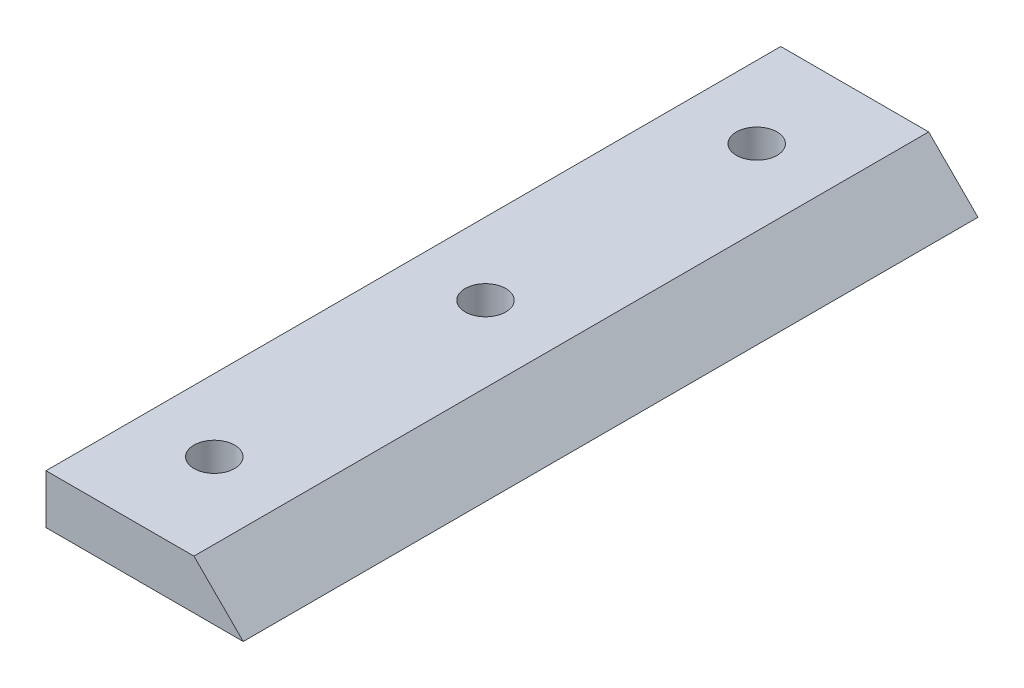
ISO-10303-21;
HEADER;
FILE_DESCRIPTION(('STEP AP214'),'2;1');
FILE_NAME('part.step','',(''),(''),'','','');
FILE_SCHEMA(('AUTOMOTIVE_DESIGN { 1 0 10303 214 1 1 1 1 }'));
ENDSEC;
DATA;
#1=APPLICATION_CONTEXT('core data for automotive mechanical design processes');
#2=APPLICATION_PROTOCOL_DEFINITION('international standard','automotive_design',2000,#1);
#3=PRODUCT_CONTEXT('',#1,'mechanical');
#4=PRODUCT('Part','Part','',(#3));
#5=PRODUCT_RELATED_PRODUCT_CATEGORY('part','',(#4));
#6=PRODUCT_DEFINITION_FORMATION('','',#4);
#7=PRODUCT_DEFINITION_CONTEXT('part definition',#1,'design');
#8=PRODUCT_DEFINITION('design','',#6,#7);
#9=PRODUCT_DEFINITION_SHAPE('','',#8);
#10=(LENGTH_UNIT() NAMED_UNIT(*) SI_UNIT(.MILLI.,.METRE.));
#11=(NAMED_UNIT(*) PLANE_ANGLE_UNIT() SI_UNIT($,.RADIAN.));
#12=(NAMED_UNIT(*) SI_UNIT($,.STERADIAN.) SOLID_ANGLE_UNIT());
#13=UNCERTAINTY_MEASURE_WITH_UNIT(LENGTH_MEASURE(1.E-05),#10,'distance_accuracy_value','');
#14=(GEOMETRIC_REPRESENTATION_CONTEXT(3) GLOBAL_UNCERTAINTY_ASSIGNED_CONTEXT((#13)) GLOBAL_UNIT_ASSIGNED_CONTEXT((#10,
#11,#12)) REPRESENTATION_CONTEXT('',''));
#15=CARTESIAN_POINT('',(0.,0.,0.));
#16=DIRECTION('',(0.,0.,1.));
#17=DIRECTION('',(1.,0.,0.));
#18=AXIS2_PLACEMENT_3D('',#15,#16,#17);
#19=CARTESIAN_POINT('',(-20.,0.,74.5));
#20=DIRECTION('',(1.,0.,0.));
#21=DIRECTION('',(0.,0.,-1.));
#22=AXIS2_PLACEMENT_3D('',#19,#20,#21);
#23=PLANE('',#22);
#24=DIRECTION('',(0.,-1.,0.));
#25=VECTOR('',#24,1.);
#26=CARTESIAN_POINT('',(-20.,0.,-74.5));
#27=LINE('',#26,#25);
#28=CARTESIAN_POINT('',(-20.,9.99999999999999,-74.5));
#29=VERTEX_POINT('',#28);
#30=CARTESIAN_POINT('',(-20.,0.,-74.5));
#31=VERTEX_POINT('',#30);
#32=EDGE_CURVE('E96',#29,#31,#27,.T.);
#33=ORIENTED_EDGE('',*,*,#32,.T.);
#34=DIRECTION('',(0.,0.,-1.));
#35=VECTOR('',#34,1.);
#36=CARTESIAN_POINT('',(-20.,0.,74.5));
#37=LINE('',#36,#35);
#38=CARTESIAN_POINT('',(-20.,0.,74.5));
#39=VERTEX_POINT('',#38);
#40=EDGE_CURVE('E11',#39,#31,#37,.T.);
#41=ORIENTED_EDGE('',*,*,#40,.F.);
#42=DIRECTION('',(0.,-1.,0.));
#43=VECTOR('',#42,1.);
#44=CARTESIAN_POINT('',(-20.,0.,74.5));
#45=LINE('',#44,#43);
#46=CARTESIAN_POINT('',(-20.,9.99999999999999,74.5));
#47=VERTEX_POINT('',#46);
#48=EDGE_CURVE('E84',#47,#39,#45,.T.);
#49=ORIENTED_EDGE('',*,*,#48,.F.);
#50=DIRECTION('',(0.,0.,-1.));
#51=VECTOR('',#50,1.);
#52=CARTESIAN_POINT('',(-20.,9.99999999999999,74.5));
#53=LINE('',#52,#51);
#54=EDGE_CURVE('E92',#47,#29,#53,.T.);
#55=ORIENTED_EDGE('',*,*,#54,.T.);
#56=EDGE_LOOP('',(#33,#41,#49,#55));
#57=FACE_BOUND('',#56,.T.);
#58=ADVANCED_FACE('F33',(#57),#23,.F.);
#59=CARTESIAN_POINT('',(20.,0.,74.5));
#60=DIRECTION('',(0.,1.,0.));
#61=DIRECTION('',(-1.,0.,0.));
#62=AXIS2_PLACEMENT_3D('',#59,#60,#61);
#63=PLANE('',#62);
#64=CARTESIAN_POINT('',(-5.37500000000001,0.,-55.));
#65=DIRECTION('',(0.,1.,0.));
#66=DIRECTION('',(1.,0.,0.));
#67=AXIS2_PLACEMENT_3D('',#64,#65,#66);
#68=CIRCLE('',#67,4.125);
#69=CARTESIAN_POINT('',(-1.25000000000001,0.,-55.));
#70=VERTEX_POINT('',#69);
#71=EDGE_CURVE('E119',#70,#70,#68,.T.);
#72=ORIENTED_EDGE('',*,*,#71,.T.);
#73=EDGE_LOOP('',(#72));
#74=FACE_BOUND('',#73,.T.);
#75=CARTESIAN_POINT('',(-5.375,0.,55.));
#76=DIRECTION('',(0.,1.,0.));
#77=DIRECTION('',(-1.,0.,0.));
#78=AXIS2_PLACEMENT_3D('',#75,#76,#77);
#79=CIRCLE('',#78,4.125);
#80=CARTESIAN_POINT('',(-9.5,0.,55.));
#81=VERTEX_POINT('',#80);
#82=EDGE_CURVE('E113',#81,#81,#79,.T.);
#83=ORIENTED_EDGE('',*,*,#82,.T.);
#84=EDGE_LOOP('',(#83));
#85=FACE_BOUND('',#84,.T.);
#86=CARTESIAN_POINT('',(-5.375,0.,0.));
#87=DIRECTION('',(0.,1.,0.));
#88=DIRECTION('',(-1.,0.,0.));
#89=AXIS2_PLACEMENT_3D('',#86,#87,#88);
#90=CIRCLE('',#89,4.125);
#91=CARTESIAN_POINT('',(-9.5,0.,0.));
#92=VERTEX_POINT('',#91);
#93=EDGE_CURVE('E99',#92,#92,#90,.T.);
#94=ORIENTED_EDGE('',*,*,#93,.T.);
#95=EDGE_LOOP('',(#94));
#96=FACE_BOUND('',#95,.T.);
#97=DIRECTION('',(1.,0.,0.));
#98=VECTOR('',#97,1.);
#99=CARTESIAN_POINT('',(20.,0.,-74.5));
#100=LINE('',#99,#98);
#101=CARTESIAN_POINT('',(20.,0.,-74.5));
#102=VERTEX_POINT('',#101);
#103=EDGE_CURVE('E88',#31,#102,#100,.T.);
#104=ORIENTED_EDGE('',*,*,#103,.T.);
#105=DIRECTION('',(0.,0.,-1.));
#106=VECTOR('',#105,1.);
#107=CARTESIAN_POINT('',(20.,0.,74.5));
#108=LINE('',#107,#106);
#109=CARTESIAN_POINT('',(20.,0.,74.5));
#110=VERTEX_POINT('',#109);
#111=EDGE_CURVE('E41',#110,#102,#108,.T.);
#112=ORIENTED_EDGE('',*,*,#111,.F.);
#113=DIRECTION('',(1.,0.,0.));
#114=VECTOR('',#113,1.);
#115=CARTESIAN_POINT('',(20.,0.,74.5));
#116=LINE('',#115,#114);
#117=EDGE_CURVE('E79',#39,#110,#116,.T.);
#118=ORIENTED_EDGE('',*,*,#117,.F.);
#119=ORIENTED_EDGE('',*,*,#40,.T.);
#120=EDGE_LOOP('',(#104,#112,#118,#119));
#121=FACE_BOUND('',#120,.T.);
#122=ADVANCED_FACE('F87',(#74,#85,#96,#121),#63,.F.);
#123=CARTESIAN_POINT('',(10.,9.99999999999999,74.5));
#124=DIRECTION('',(-0.707106781186547,-0.707106781186548,0.));
#125=DIRECTION('',(0.707106781186548,-0.707106781186547,0.));
#126=AXIS2_PLACEMENT_3D('',#123,#124,#125);
#127=PLANE('',#126);
#128=DIRECTION('',(-0.707106781186548,0.707106781186547,0.));
#129=VECTOR('',#128,1.);
#130=CARTESIAN_POINT('',(10.,9.99999999999999,-74.5));
#131=LINE('',#130,#129);
#132=CARTESIAN_POINT('',(10.,9.99999999999999,-74.5));
#133=VERTEX_POINT('',#132);
#134=EDGE_CURVE('E66',#102,#133,#131,.T.);
#135=ORIENTED_EDGE('',*,*,#134,.T.);
#136=DIRECTION('',(0.,0.,-1.));
#137=VECTOR('',#136,1.);
#138=CARTESIAN_POINT('',(10.,9.99999999999999,74.5));
#139=LINE('',#138,#137);
#140=CARTESIAN_POINT('',(10.,9.99999999999999,74.5));
#141=VERTEX_POINT('',#140);
#142=EDGE_CURVE('E89',#141,#133,#139,.T.);
#143=ORIENTED_EDGE('',*,*,#142,.F.);
#144=DIRECTION('',(-0.707106781186548,0.707106781186547,0.));
#145=VECTOR('',#144,1.);
#146=CARTESIAN_POINT('',(10.,9.99999999999999,74.5));
#147=LINE('',#146,#145);
#148=EDGE_CURVE('E82',#110,#141,#147,.T.);
#149=ORIENTED_EDGE('',*,*,#148,.F.);
#150=ORIENTED_EDGE('',*,*,#111,.T.);
#151=EDGE_LOOP('',(#135,#143,#149,#150));
#152=FACE_BOUND('',#151,.T.);
#153=ADVANCED_FACE('F90',(#152),#127,.F.);
#154=CARTESIAN_POINT('',(-20.,9.99999999999999,74.5));
#155=DIRECTION('',(0.,-1.,0.));
#156=DIRECTION('',(1.,0.,0.));
#157=AXIS2_PLACEMENT_3D('',#154,#155,#156);
#158=PLANE('',#157);
#159=CARTESIAN_POINT('',(-5.37500000000001,9.99999999999999,-55.));
#160=DIRECTION('',(0.,1.,0.));
#161=DIRECTION('',(1.,0.,0.));
#162=AXIS2_PLACEMENT_3D('',#159,#160,#161);
#163=CIRCLE('',#162,4.125);
#164=CARTESIAN_POINT('',(-1.25000000000001,9.99999999999999,-55.));
#165=VERTEX_POINT('',#164);
#166=EDGE_CURVE('E116',#165,#165,#163,.T.);
#167=ORIENTED_EDGE('',*,*,#166,.F.);
#168=EDGE_LOOP('',(#167));
#169=FACE_BOUND('',#168,.T.);
#170=CARTESIAN_POINT('',(-5.375,9.99999999999999,55.));
#171=DIRECTION('',(0.,1.,0.));
#172=DIRECTION('',(-1.,0.,0.));
#173=AXIS2_PLACEMENT_3D('',#170,#171,#172);
#174=CIRCLE('',#173,4.125);
#175=CARTESIAN_POINT('',(-9.5,9.99999999999999,55.));
#176=VERTEX_POINT('',#175);
#177=EDGE_CURVE('E122',#176,#176,#174,.T.);
#178=ORIENTED_EDGE('',*,*,#177,.F.);
#179=EDGE_LOOP('',(#178));
#180=FACE_BOUND('',#179,.T.);
#181=CARTESIAN_POINT('',(-5.375,9.99999999999999,0.));
#182=DIRECTION('',(0.,1.,0.));
#183=DIRECTION('',(-1.,0.,0.));
#184=AXIS2_PLACEMENT_3D('',#181,#182,#183);
#185=CIRCLE('',#184,4.125);
#186=CARTESIAN_POINT('',(-9.5,9.99999999999999,0.));
#187=VERTEX_POINT('',#186);
#188=EDGE_CURVE('E110',#187,#187,#185,.T.);
#189=ORIENTED_EDGE('',*,*,#188,.F.);
#190=EDGE_LOOP('',(#189));
#191=FACE_BOUND('',#190,.T.);
#192=DIRECTION('',(-1.,0.,0.));
#193=VECTOR('',#192,1.);
#194=CARTESIAN_POINT('',(-20.,9.99999999999999,-74.5));
#195=LINE('',#194,#193);
#196=EDGE_CURVE('E72',#133,#29,#195,.T.);
#197=ORIENTED_EDGE('',*,*,#196,.T.);
#198=ORIENTED_EDGE('',*,*,#54,.F.);
#199=DIRECTION('',(-1.,0.,0.));
#200=VECTOR('',#199,1.);
#201=CARTESIAN_POINT('',(-20.,9.99999999999999,74.5));
#202=LINE('',#201,#200);
#203=EDGE_CURVE('E49',#141,#47,#202,.T.);
#204=ORIENTED_EDGE('',*,*,#203,.F.);
#205=ORIENTED_EDGE('',*,*,#142,.T.);
#206=EDGE_LOOP('',(#197,#198,#204,#205));
#207=FACE_BOUND('',#206,.T.);
#208=ADVANCED_FACE('F104',(#169,#180,#191,#207),#158,.F.);
#209=CARTESIAN_POINT('',(0.,0.,74.5));
#210=DIRECTION('',(0.,0.,-1.));
#211=DIRECTION('',(-1.,0.,0.));
#212=AXIS2_PLACEMENT_3D('',#209,#210,#211);
#213=PLANE('',#212);
#214=ORIENTED_EDGE('',*,*,#48,.T.);
#215=ORIENTED_EDGE('',*,*,#117,.T.);
#216=ORIENTED_EDGE('',*,*,#148,.T.);
#217=ORIENTED_EDGE('',*,*,#203,.T.);
#218=EDGE_LOOP('',(#214,#215,#216,#217));
#219=FACE_BOUND('',#218,.T.);
#220=ADVANCED_FACE('F80',(#219),#213,.F.);
#221=CARTESIAN_POINT('',(0.,0.,-74.5));
#222=DIRECTION('',(0.,0.,-1.));
#223=DIRECTION('',(-1.,0.,0.));
#224=AXIS2_PLACEMENT_3D('',#221,#222,#223);
#225=PLANE('',#224);
#226=ORIENTED_EDGE('',*,*,#32,.F.);
#227=ORIENTED_EDGE('',*,*,#196,.F.);
#228=ORIENTED_EDGE('',*,*,#134,.F.);
#229=ORIENTED_EDGE('',*,*,#103,.F.);
#230=EDGE_LOOP('',(#226,#227,#228,#229));
#231=FACE_BOUND('',#230,.T.);
#232=ADVANCED_FACE('F107',(#231),#225,.T.);
#233=CARTESIAN_POINT('',(-5.375,0.,0.));
#234=DIRECTION('',(0.,1.,0.));
#235=DIRECTION('',(-1.,0.,0.));
#236=AXIS2_PLACEMENT_3D('',#233,#234,#235);
#237=CYLINDRICAL_SURFACE('',#236,4.125);
#238=ORIENTED_EDGE('',*,*,#93,.F.);
#239=EDGE_LOOP('',(#238));
#240=FACE_BOUND('',#239,.T.);
#241=ORIENTED_EDGE('',*,*,#188,.T.);
#242=EDGE_LOOP('',(#241));
#243=FACE_BOUND('',#242,.T.);
#244=ADVANCED_FACE('F134',(#240,#243),#237,.F.);
#245=CARTESIAN_POINT('',(-5.375,0.,55.));
#246=DIRECTION('',(0.,1.,0.));
#247=DIRECTION('',(-1.,0.,0.));
#248=AXIS2_PLACEMENT_3D('',#245,#246,#247);
#249=CYLINDRICAL_SURFACE('',#248,4.125);
#250=ORIENTED_EDGE('',*,*,#82,.F.);
#251=EDGE_LOOP('',(#250));
#252=FACE_BOUND('',#251,.T.);
#253=ORIENTED_EDGE('',*,*,#177,.T.);
#254=EDGE_LOOP('',(#253));
#255=FACE_BOUND('',#254,.T.);
#256=ADVANCED_FACE('F130',(#252,#255),#249,.F.);
#257=CARTESIAN_POINT('',(-5.37500000000001,0.,-55.));
#258=DIRECTION('',(0.,1.,0.));
#259=DIRECTION('',(-1.,0.,0.));
#260=AXIS2_PLACEMENT_3D('',#257,#258,#259);
#261=CYLINDRICAL_SURFACE('',#260,4.125);
#262=ORIENTED_EDGE('',*,*,#71,.F.);
#263=EDGE_LOOP('',(#262));
#264=FACE_BOUND('',#263,.T.);
#265=ORIENTED_EDGE('',*,*,#166,.T.);
#266=EDGE_LOOP('',(#265));
#267=FACE_BOUND('',#266,.T.);
#268=ADVANCED_FACE('F133',(#264,#267),#261,.F.);
#269=CLOSED_SHELL('',(#58,#122,#153,#208,#220,#232,#244,#256,#268));
#270=MANIFOLD_SOLID_BREP('B2',#269);
#271=ADVANCED_BREP_SHAPE_REPRESENTATION('',(#18,#270),#14);
#272=SHAPE_DEFINITION_REPRESENTATION(#9,#271);
ENDSEC;
END-ISO-10303-21;
